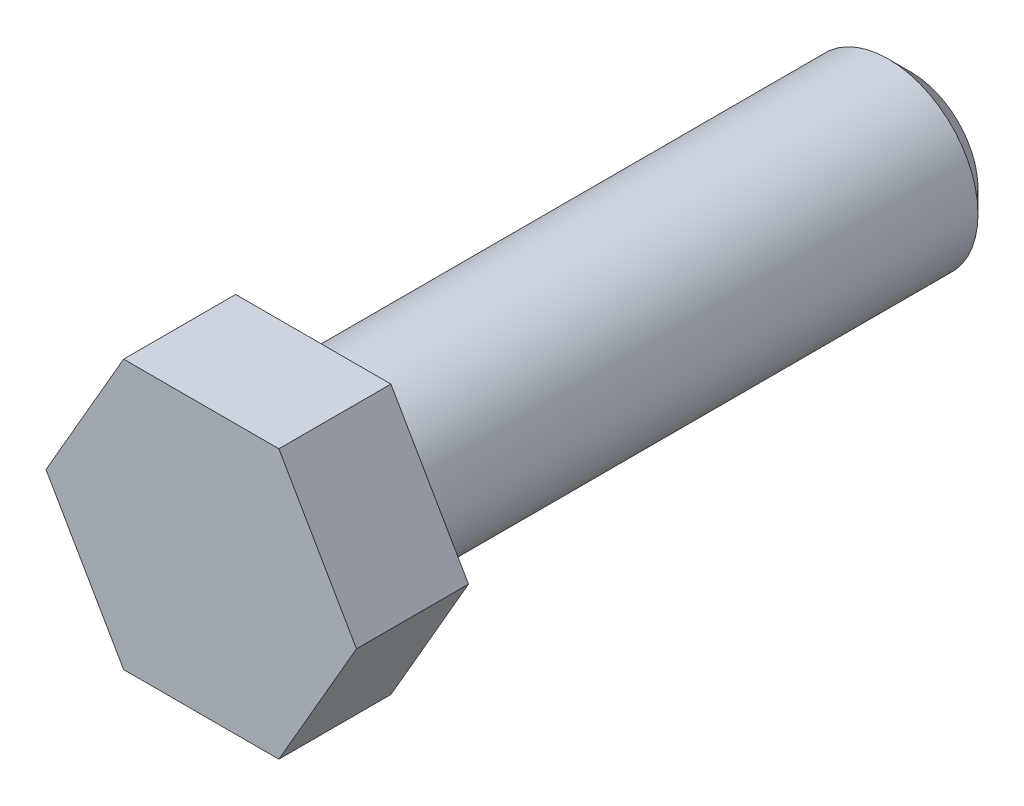
ISO-10303-21;
HEADER;
FILE_DESCRIPTION(('STEP AP214'),'2;1');
FILE_NAME('part.step','',(''),(''),'','','');
FILE_SCHEMA(('AUTOMOTIVE_DESIGN { 1 0 10303 214 1 1 1 1 }'));
ENDSEC;
DATA;
#1=APPLICATION_CONTEXT('core data for automotive mechanical design processes');
#2=APPLICATION_PROTOCOL_DEFINITION('international standard','automotive_design',2000,#1);
#3=PRODUCT_CONTEXT('',#1,'mechanical');
#4=PRODUCT('Part','Part','',(#3));
#5=PRODUCT_RELATED_PRODUCT_CATEGORY('part','',(#4));
#6=PRODUCT_DEFINITION_FORMATION('','',#4);
#7=PRODUCT_DEFINITION_CONTEXT('part definition',#1,'design');
#8=PRODUCT_DEFINITION('design','',#6,#7);
#9=PRODUCT_DEFINITION_SHAPE('','',#8);
#10=(LENGTH_UNIT() NAMED_UNIT(*) SI_UNIT(.MILLI.,.METRE.));
#11=(NAMED_UNIT(*) PLANE_ANGLE_UNIT() SI_UNIT($,.RADIAN.));
#12=(NAMED_UNIT(*) SI_UNIT($,.STERADIAN.) SOLID_ANGLE_UNIT());
#13=UNCERTAINTY_MEASURE_WITH_UNIT(LENGTH_MEASURE(1.E-05),#10,'distance_accuracy_value','');
#14=(GEOMETRIC_REPRESENTATION_CONTEXT(3) GLOBAL_UNCERTAINTY_ASSIGNED_CONTEXT((#13)) GLOBAL_UNIT_ASSIGNED_CONTEXT((#10,
#11,#12)) REPRESENTATION_CONTEXT('',''));
#15=CARTESIAN_POINT('',(0.,0.,0.));
#16=DIRECTION('',(0.,0.,1.));
#17=DIRECTION('',(1.,0.,0.));
#18=AXIS2_PLACEMENT_3D('',#15,#16,#17);
#19=CARTESIAN_POINT('',(-5.19615242270664,9.,0.));
#20=DIRECTION('',(0.,0.,1.));
#21=DIRECTION('',(1.,0.,0.));
#22=AXIS2_PLACEMENT_3D('',#19,#20,#21);
#23=PLANE('',#22);
#24=DIRECTION('',(-0.499999999999999,-0.866025403784439,0.));
#25=VECTOR('',#24,1.);
#26=CARTESIAN_POINT('',(-5.19615242270664,9.,0.));
#27=LINE('',#26,#25);
#28=CARTESIAN_POINT('',(-5.19615242270664,9.,0.));
#29=VERTEX_POINT('',#28);
#30=CARTESIAN_POINT('',(-10.3923048454133,0.,0.));
#31=VERTEX_POINT('',#30);
#32=EDGE_CURVE('E117',#29,#31,#27,.T.);
#33=ORIENTED_EDGE('',*,*,#32,.F.);
#34=DIRECTION('',(1.,0.,0.));
#35=VECTOR('',#34,1.);
#36=CARTESIAN_POINT('',(-5.19615242270664,9.,0.));
#37=LINE('',#36,#35);
#38=CARTESIAN_POINT('',(5.19615242270662,9.,0.));
#39=VERTEX_POINT('',#38);
#40=EDGE_CURVE('E127',#29,#39,#37,.T.);
#41=ORIENTED_EDGE('',*,*,#40,.T.);
#42=DIRECTION('',(0.5,-0.866025403784438,0.));
#43=VECTOR('',#42,1.);
#44=CARTESIAN_POINT('',(5.19615242270662,9.,0.));
#45=LINE('',#44,#43);
#46=CARTESIAN_POINT('',(10.3923048454133,0.,0.));
#47=VERTEX_POINT('',#46);
#48=EDGE_CURVE('E125',#39,#47,#45,.T.);
#49=ORIENTED_EDGE('',*,*,#48,.T.);
#50=DIRECTION('',(-0.499999999999999,-0.866025403784439,0.));
#51=VECTOR('',#50,1.);
#52=CARTESIAN_POINT('',(10.3923048454133,0.,0.));
#53=LINE('',#52,#51);
#54=CARTESIAN_POINT('',(5.19615242270663,-9.00000000000001,0.));
#55=VERTEX_POINT('',#54);
#56=EDGE_CURVE('E96',#47,#55,#53,.T.);
#57=ORIENTED_EDGE('',*,*,#56,.T.);
#58=DIRECTION('',(1.,0.,0.));
#59=VECTOR('',#58,1.);
#60=CARTESIAN_POINT('',(-5.19615242270663,-9.00000000000001,0.));
#61=LINE('',#60,#59);
#62=CARTESIAN_POINT('',(-5.19615242270663,-9.00000000000001,0.));
#63=VERTEX_POINT('',#62);
#64=EDGE_CURVE('E121',#63,#55,#61,.T.);
#65=ORIENTED_EDGE('',*,*,#64,.F.);
#66=DIRECTION('',(0.5,-0.866025403784439,0.));
#67=VECTOR('',#66,1.);
#68=CARTESIAN_POINT('',(-10.3923048454133,0.,0.));
#69=LINE('',#68,#67);
#70=EDGE_CURVE('E119',#31,#63,#69,.T.);
#71=ORIENTED_EDGE('',*,*,#70,.F.);
#72=EDGE_LOOP('',(#33,#41,#49,#57,#65,#71));
#73=FACE_BOUND('',#72,.T.);
#74=CARTESIAN_POINT('',(0.,0.,0.));
#75=DIRECTION('',(0.,0.,1.));
#76=DIRECTION('',(1.,0.,0.));
#77=AXIS2_PLACEMENT_3D('',#74,#75,#76);
#78=CIRCLE('',#77,6.);
#79=CARTESIAN_POINT('',(6.,0.,0.));
#80=VERTEX_POINT('',#79);
#81=EDGE_CURVE('E139',#80,#80,#78,.F.);
#82=ORIENTED_EDGE('',*,*,#81,.F.);
#83=EDGE_LOOP('',(#82));
#84=FACE_BOUND('',#83,.T.);
#85=ADVANCED_FACE('F31',(#73,#84),#23,.F.);
#86=CARTESIAN_POINT('',(-5.19615242270664,9.,7.5));
#87=DIRECTION('',(0.866025403784439,-0.499999999999999,0.));
#88=DIRECTION('',(0.499999999999999,0.866025403784439,0.));
#89=AXIS2_PLACEMENT_3D('',#86,#87,#88);
#90=PLANE('',#89);
#91=ORIENTED_EDGE('',*,*,#32,.T.);
#92=DIRECTION('',(0.,0.,-1.));
#93=VECTOR('',#92,1.);
#94=CARTESIAN_POINT('',(-10.3923048454133,0.,7.5));
#95=LINE('',#94,#93);
#96=CARTESIAN_POINT('',(-10.3923048454133,0.,7.5));
#97=VERTEX_POINT('',#96);
#98=EDGE_CURVE('E137',#97,#31,#95,.T.);
#99=ORIENTED_EDGE('',*,*,#98,.F.);
#100=DIRECTION('',(-0.499999999999999,-0.866025403784439,0.));
#101=VECTOR('',#100,1.);
#102=CARTESIAN_POINT('',(-5.19615242270664,9.,7.5));
#103=LINE('',#102,#101);
#104=CARTESIAN_POINT('',(-5.19615242270664,9.,7.5));
#105=VERTEX_POINT('',#104);
#106=EDGE_CURVE('E130',#105,#97,#103,.T.);
#107=ORIENTED_EDGE('',*,*,#106,.F.);
#108=DIRECTION('',(0.,0.,-1.));
#109=VECTOR('',#108,1.);
#110=CARTESIAN_POINT('',(-5.19615242270664,9.,7.5));
#111=LINE('',#110,#109);
#112=EDGE_CURVE('E48',#105,#29,#111,.T.);
#113=ORIENTED_EDGE('',*,*,#112,.T.);
#114=EDGE_LOOP('',(#91,#99,#107,#113));
#115=FACE_BOUND('',#114,.T.);
#116=ADVANCED_FACE('F155',(#115),#90,.F.);
#117=CARTESIAN_POINT('',(-10.3923048454133,0.,7.5));
#118=DIRECTION('',(0.866025403784439,0.5,0.));
#119=DIRECTION('',(-0.5,0.866025403784439,0.));
#120=AXIS2_PLACEMENT_3D('',#117,#118,#119);
#121=PLANE('',#120);
#122=ORIENTED_EDGE('',*,*,#70,.T.);
#123=DIRECTION('',(0.,0.,-1.));
#124=VECTOR('',#123,1.);
#125=CARTESIAN_POINT('',(-5.19615242270663,-9.00000000000001,7.5));
#126=LINE('',#125,#124);
#127=CARTESIAN_POINT('',(-5.19615242270663,-9.00000000000001,7.5));
#128=VERTEX_POINT('',#127);
#129=EDGE_CURVE('E134',#128,#63,#126,.T.);
#130=ORIENTED_EDGE('',*,*,#129,.F.);
#131=DIRECTION('',(0.5,-0.866025403784439,0.));
#132=VECTOR('',#131,1.);
#133=CARTESIAN_POINT('',(-10.3923048454133,0.,7.5));
#134=LINE('',#133,#132);
#135=EDGE_CURVE('E81',#97,#128,#134,.T.);
#136=ORIENTED_EDGE('',*,*,#135,.F.);
#137=ORIENTED_EDGE('',*,*,#98,.T.);
#138=EDGE_LOOP('',(#122,#130,#136,#137));
#139=FACE_BOUND('',#138,.T.);
#140=ADVANCED_FACE('F161',(#139),#121,.F.);
#141=CARTESIAN_POINT('',(-5.19615242270663,-9.00000000000001,7.5));
#142=DIRECTION('',(0.,1.,0.));
#143=DIRECTION('',(0.,0.,1.));
#144=AXIS2_PLACEMENT_3D('',#141,#142,#143);
#145=PLANE('',#144);
#146=ORIENTED_EDGE('',*,*,#64,.T.);
#147=DIRECTION('',(0.,0.,-1.));
#148=VECTOR('',#147,1.);
#149=CARTESIAN_POINT('',(5.19615242270663,-9.00000000000001,7.5));
#150=LINE('',#149,#148);
#151=CARTESIAN_POINT('',(5.19615242270663,-9.00000000000001,7.5));
#152=VERTEX_POINT('',#151);
#153=EDGE_CURVE('E100',#152,#55,#150,.T.);
#154=ORIENTED_EDGE('',*,*,#153,.F.);
#155=DIRECTION('',(1.,0.,0.));
#156=VECTOR('',#155,1.);
#157=CARTESIAN_POINT('',(-5.19615242270663,-9.00000000000001,7.5));
#158=LINE('',#157,#156);
#159=EDGE_CURVE('E108',#128,#152,#158,.T.);
#160=ORIENTED_EDGE('',*,*,#159,.F.);
#161=ORIENTED_EDGE('',*,*,#129,.T.);
#162=EDGE_LOOP('',(#146,#154,#160,#161));
#163=FACE_BOUND('',#162,.T.);
#164=ADVANCED_FACE('F173',(#163),#145,.F.);
#165=CARTESIAN_POINT('',(10.3923048454133,0.,7.5));
#166=DIRECTION('',(0.866025403784439,-0.499999999999999,0.));
#167=DIRECTION('',(0.499999999999999,0.866025403784439,0.));
#168=AXIS2_PLACEMENT_3D('',#165,#166,#167);
#169=PLANE('',#168);
#170=ORIENTED_EDGE('',*,*,#56,.F.);
#171=DIRECTION('',(0.,0.,-1.));
#172=VECTOR('',#171,1.);
#173=CARTESIAN_POINT('',(10.3923048454133,0.,7.5));
#174=LINE('',#173,#172);
#175=CARTESIAN_POINT('',(10.3923048454133,0.,7.5));
#176=VERTEX_POINT('',#175);
#177=EDGE_CURVE('E91',#176,#47,#174,.T.);
#178=ORIENTED_EDGE('',*,*,#177,.F.);
#179=DIRECTION('',(-0.499999999999999,-0.866025403784439,0.));
#180=VECTOR('',#179,1.);
#181=CARTESIAN_POINT('',(10.3923048454133,0.,7.5));
#182=LINE('',#181,#180);
#183=EDGE_CURVE('E94',#176,#152,#182,.T.);
#184=ORIENTED_EDGE('',*,*,#183,.T.);
#185=ORIENTED_EDGE('',*,*,#153,.T.);
#186=EDGE_LOOP('',(#170,#178,#184,#185));
#187=FACE_BOUND('',#186,.T.);
#188=ADVANCED_FACE('F93',(#187),#169,.T.);
#189=CARTESIAN_POINT('',(5.19615242270662,9.,7.5));
#190=DIRECTION('',(0.866025403784438,0.5,0.));
#191=DIRECTION('',(-0.5,0.866025403784439,0.));
#192=AXIS2_PLACEMENT_3D('',#189,#190,#191);
#193=PLANE('',#192);
#194=ORIENTED_EDGE('',*,*,#48,.F.);
#195=DIRECTION('',(0.,0.,-1.));
#196=VECTOR('',#195,1.);
#197=CARTESIAN_POINT('',(5.19615242270662,9.,7.5));
#198=LINE('',#197,#196);
#199=CARTESIAN_POINT('',(5.19615242270662,9.,7.5));
#200=VERTEX_POINT('',#199);
#201=EDGE_CURVE('E68',#200,#39,#198,.T.);
#202=ORIENTED_EDGE('',*,*,#201,.F.);
#203=DIRECTION('',(0.5,-0.866025403784438,0.));
#204=VECTOR('',#203,1.);
#205=CARTESIAN_POINT('',(5.19615242270662,9.,7.5));
#206=LINE('',#205,#204);
#207=EDGE_CURVE('E106',#200,#176,#206,.T.);
#208=ORIENTED_EDGE('',*,*,#207,.T.);
#209=ORIENTED_EDGE('',*,*,#177,.T.);
#210=EDGE_LOOP('',(#194,#202,#208,#209));
#211=FACE_BOUND('',#210,.T.);
#212=ADVANCED_FACE('F111',(#211),#193,.T.);
#213=CARTESIAN_POINT('',(-5.19615242270664,9.,7.5));
#214=DIRECTION('',(0.,1.,0.));
#215=DIRECTION('',(0.,0.,1.));
#216=AXIS2_PLACEMENT_3D('',#213,#214,#215);
#217=PLANE('',#216);
#218=ORIENTED_EDGE('',*,*,#40,.F.);
#219=ORIENTED_EDGE('',*,*,#112,.F.);
#220=DIRECTION('',(1.,0.,0.));
#221=VECTOR('',#220,1.);
#222=CARTESIAN_POINT('',(-5.19615242270664,9.,7.5));
#223=LINE('',#222,#221);
#224=EDGE_CURVE('E112',#105,#200,#223,.T.);
#225=ORIENTED_EDGE('',*,*,#224,.T.);
#226=ORIENTED_EDGE('',*,*,#201,.T.);
#227=EDGE_LOOP('',(#218,#219,#225,#226));
#228=FACE_BOUND('',#227,.T.);
#229=ADVANCED_FACE('F166',(#228),#217,.T.);
#230=CARTESIAN_POINT('',(-5.19615242270664,9.,7.5));
#231=DIRECTION('',(0.,0.,1.));
#232=DIRECTION('',(1.,0.,0.));
#233=AXIS2_PLACEMENT_3D('',#230,#231,#232);
#234=PLANE('',#233);
#235=ORIENTED_EDGE('',*,*,#106,.T.);
#236=ORIENTED_EDGE('',*,*,#135,.T.);
#237=ORIENTED_EDGE('',*,*,#159,.T.);
#238=ORIENTED_EDGE('',*,*,#183,.F.);
#239=ORIENTED_EDGE('',*,*,#207,.F.);
#240=ORIENTED_EDGE('',*,*,#224,.F.);
#241=EDGE_LOOP('',(#235,#236,#237,#238,#239,#240));
#242=FACE_BOUND('',#241,.T.);
#243=ADVANCED_FACE('F104',(#242),#234,.T.);
#244=CARTESIAN_POINT('',(0.,0.,-40.));
#245=DIRECTION('',(0.,0.,1.));
#246=DIRECTION('',(1.,0.,0.));
#247=AXIS2_PLACEMENT_3D('',#244,#245,#246);
#248=CYLINDRICAL_SURFACE('',#247,6.);
#249=CARTESIAN_POINT('',(0.,0.,-38.5));
#250=DIRECTION('',(0.,0.,-1.));
#251=DIRECTION('',(-1.,0.,0.));
#252=AXIS2_PLACEMENT_3D('',#249,#250,#251);
#253=CIRCLE('',#252,6.);
#254=CARTESIAN_POINT('',(-6.,0.,-38.5));
#255=VERTEX_POINT('',#254);
#256=EDGE_CURVE('E11',#255,#255,#253,.F.);
#257=ORIENTED_EDGE('',*,*,#256,.T.);
#258=EDGE_LOOP('',(#257));
#259=FACE_BOUND('',#258,.T.);
#260=ORIENTED_EDGE('',*,*,#81,.T.);
#261=EDGE_LOOP('',(#260));
#262=FACE_BOUND('',#261,.T.);
#263=ADVANCED_FACE('F151',(#259,#262),#248,.T.);
#264=CARTESIAN_POINT('',(0.,0.,-40.));
#265=DIRECTION('',(0.,0.,-1.));
#266=DIRECTION('',(-1.,0.,0.));
#267=AXIS2_PLACEMENT_3D('',#264,#265,#266);
#268=PLANE('',#267);
#269=CARTESIAN_POINT('',(0.,0.,-40.));
#270=DIRECTION('',(0.,0.,-1.));
#271=DIRECTION('',(-1.,0.,0.));
#272=AXIS2_PLACEMENT_3D('',#269,#270,#271);
#273=CIRCLE('',#272,4.49999999999997);
#274=CARTESIAN_POINT('',(-4.49999999999997,0.,-40.));
#275=VERTEX_POINT('',#274);
#276=EDGE_CURVE('E40',#275,#275,#273,.T.);
#277=ORIENTED_EDGE('',*,*,#276,.T.);
#278=EDGE_LOOP('',(#277));
#279=FACE_BOUND('',#278,.T.);
#280=ADVANCED_FACE('F144',(#279),#268,.T.);
#281=CARTESIAN_POINT('',(0.,0.,-40.));
#282=DIRECTION('',(0.,0.,1.));
#283=DIRECTION('',(1.,0.,0.));
#284=AXIS2_PLACEMENT_3D('',#281,#282,#283);
#285=CONICAL_SURFACE('',#284,4.49999999999997,0.785398163397454);
#286=ORIENTED_EDGE('',*,*,#256,.F.);
#287=EDGE_LOOP('',(#286));
#288=FACE_BOUND('',#287,.T.);
#289=ORIENTED_EDGE('',*,*,#276,.F.);
#290=EDGE_LOOP('',(#289));
#291=FACE_BOUND('',#290,.T.);
#292=ADVANCED_FACE('F33',(#288,#291),#285,.T.);
#293=CLOSED_SHELL('',(#85,#116,#140,#164,#188,#212,#229,#243,#263,#280,#292));
#294=MANIFOLD_SOLID_BREP('B2',#293);
#295=ADVANCED_BREP_SHAPE_REPRESENTATION('',(#18,#294),#14);
#296=SHAPE_DEFINITION_REPRESENTATION(#9,#295);
ENDSEC;
END-ISO-10303-21;
